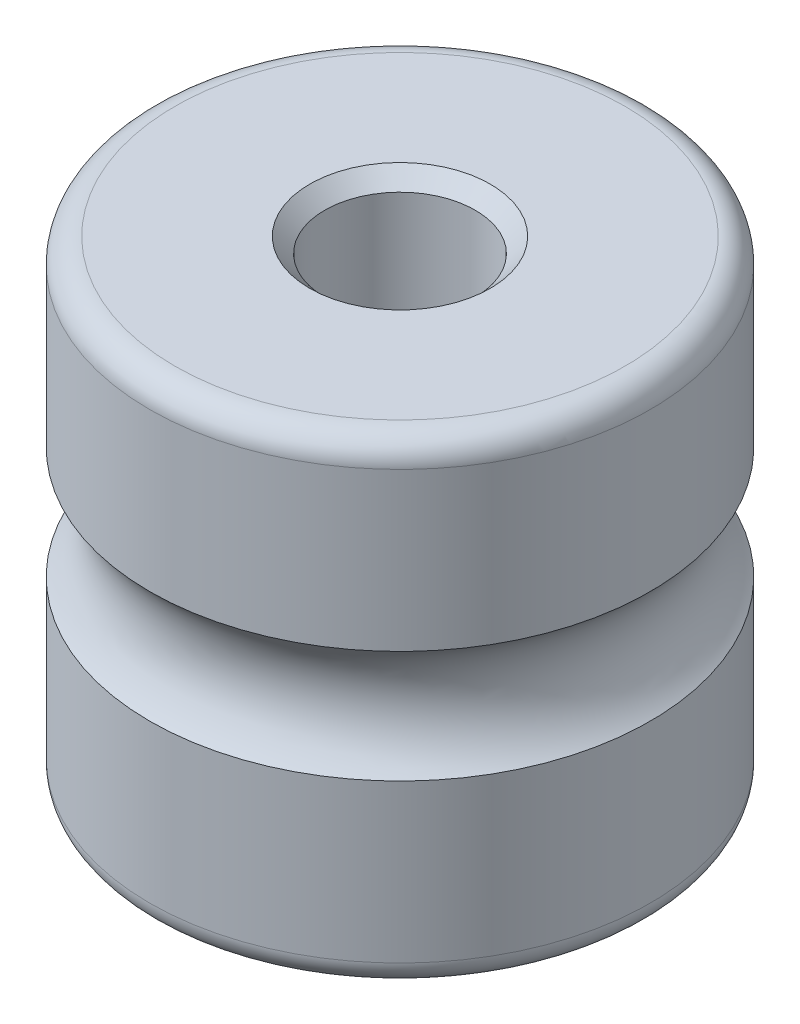
ISO-10303-21;
HEADER;
FILE_DESCRIPTION(('STEP AP214'),'2;1');
FILE_NAME('part.step','',(''),(''),'','','');
FILE_SCHEMA(('AUTOMOTIVE_DESIGN { 1 0 10303 214 1 1 1 1 }'));
ENDSEC;
DATA;
#1=APPLICATION_CONTEXT('core data for automotive mechanical design processes');
#2=APPLICATION_PROTOCOL_DEFINITION('international standard','automotive_design',2000,#1);
#3=PRODUCT_CONTEXT('',#1,'mechanical');
#4=PRODUCT('Part','Part','',(#3));
#5=PRODUCT_RELATED_PRODUCT_CATEGORY('part','',(#4));
#6=PRODUCT_DEFINITION_FORMATION('','',#4);
#7=PRODUCT_DEFINITION_CONTEXT('part definition',#1,'design');
#8=PRODUCT_DEFINITION('design','',#6,#7);
#9=PRODUCT_DEFINITION_SHAPE('','',#8);
#10=(LENGTH_UNIT() NAMED_UNIT(*) SI_UNIT(.MILLI.,.METRE.));
#11=(NAMED_UNIT(*) PLANE_ANGLE_UNIT() SI_UNIT($,.RADIAN.));
#12=(NAMED_UNIT(*) SI_UNIT($,.STERADIAN.) SOLID_ANGLE_UNIT());
#13=UNCERTAINTY_MEASURE_WITH_UNIT(LENGTH_MEASURE(1.E-05),#10,'distance_accuracy_value','');
#14=(GEOMETRIC_REPRESENTATION_CONTEXT(3) GLOBAL_UNCERTAINTY_ASSIGNED_CONTEXT((#13)) GLOBAL_UNIT_ASSIGNED_CONTEXT((#10,
#11,#12)) REPRESENTATION_CONTEXT('',''));
#15=CARTESIAN_POINT('',(0.,0.,0.));
#16=DIRECTION('',(0.,0.,1.));
#17=DIRECTION('',(1.,0.,0.));
#18=AXIS2_PLACEMENT_3D('',#15,#16,#17);
#19=CARTESIAN_POINT('',(-989.291415846363,750.161234304223,-54.7299999999999));
#20=DIRECTION('',(0.,-1.,0.));
#21=DIRECTION('',(0.,0.,-1.));
#22=AXIS2_PLACEMENT_3D('',#19,#20,#21);
#23=CYLINDRICAL_SURFACE('',#22,49.8549999999999);
#24=CARTESIAN_POINT('',(-989.291415846363,604.150000000002,-54.7299999999999));
#25=DIRECTION('',(0.,1.,0.));
#26=DIRECTION('',(0.,0.,1.));
#27=AXIS2_PLACEMENT_3D('',#24,#25,#26);
#28=CIRCLE('',#27,49.8549999999999);
#29=CARTESIAN_POINT('',(-989.291415846363,604.150000000002,-104.585));
#30=VERTEX_POINT('',#29);
#31=EDGE_CURVE('E10',#30,#30,#28,.F.);
#32=CARTESIAN_POINT('',(-989.291415846363,572.740339887501,-54.7299999999999));
#33=DIRECTION('',(0.,-1.,0.));
#34=DIRECTION('',(0.,0.,-1.));
#35=AXIS2_PLACEMENT_3D('',#32,#33,#34);
#36=CIRCLE('',#35,49.8549999999999);
#37=CARTESIAN_POINT('',(-989.291415846363,572.740339887501,-104.585));
#38=VERTEX_POINT('',#37);
#39=EDGE_CURVE('E70',#38,#38,#36,.F.);
#40=CARTESIAN_POINT('',(-989.291415846363,604.150000000002,-104.585));
#41=CARTESIAN_POINT('',(-989.291415846363,603.822816040497,-104.585));
#42=CARTESIAN_POINT('',(-989.291415846363,603.495632080991,-104.585));
#43=CARTESIAN_POINT('',(-989.291415846363,602.841264161981,-104.585));
#44=CARTESIAN_POINT('',(-989.291415846363,602.514080202476,-104.585));
#45=CARTESIAN_POINT('',(-989.291415846363,601.859712283465,-104.585));
#46=CARTESIAN_POINT('',(-989.291415846363,601.53252832396,-104.585));
#47=CARTESIAN_POINT('',(-989.291415846363,600.87816040495,-104.585));
#48=CARTESIAN_POINT('',(-989.291415846363,600.550976445445,-104.585));
#49=CARTESIAN_POINT('',(-989.291415846363,599.896608526434,-104.585));
#50=CARTESIAN_POINT('',(-989.291415846363,599.569424566929,-104.585));
#51=CARTESIAN_POINT('',(-989.291415846363,598.915056647918,-104.585));
#52=CARTESIAN_POINT('',(-989.291415846363,598.587872688413,-104.585));
#53=CARTESIAN_POINT('',(-989.291415846363,597.933504769403,-104.585));
#54=CARTESIAN_POINT('',(-989.291415846363,597.606320809898,-104.585));
#55=CARTESIAN_POINT('',(-989.291415846363,596.951952890887,-104.585));
#56=CARTESIAN_POINT('',(-989.291415846363,596.624768931382,-104.585));
#57=CARTESIAN_POINT('',(-989.291415846363,595.970401012371,-104.585));
#58=CARTESIAN_POINT('',(-989.291415846363,595.643217052866,-104.585));
#59=CARTESIAN_POINT('',(-989.291415846363,594.988849133856,-104.585));
#60=CARTESIAN_POINT('',(-989.291415846363,594.661665174351,-104.585));
#61=CARTESIAN_POINT('',(-989.291415846363,594.00729725534,-104.585));
#62=CARTESIAN_POINT('',(-989.291415846363,593.680113295835,-104.585));
#63=CARTESIAN_POINT('',(-989.291415846363,593.025745376824,-104.585));
#64=CARTESIAN_POINT('',(-989.291415846363,592.698561417319,-104.585));
#65=CARTESIAN_POINT('',(-989.291415846363,592.044193498309,-104.585));
#66=CARTESIAN_POINT('',(-989.291415846363,591.717009538804,-104.585));
#67=CARTESIAN_POINT('',(-989.291415846363,591.062641619793,-104.585));
#68=CARTESIAN_POINT('',(-989.291415846363,590.735457660288,-104.585));
#69=CARTESIAN_POINT('',(-989.291415846363,590.081089741278,-104.585));
#70=CARTESIAN_POINT('',(-989.291415846363,589.753905781772,-104.585));
#71=CARTESIAN_POINT('',(-989.291415846363,589.099537862762,-104.585));
#72=CARTESIAN_POINT('',(-989.291415846363,588.772353903257,-104.585));
#73=CARTESIAN_POINT('',(-989.291415846363,588.117985984246,-104.585));
#74=CARTESIAN_POINT('',(-989.291415846363,587.790802024741,-104.585));
#75=CARTESIAN_POINT('',(-989.291415846363,587.13643410573,-104.585));
#76=CARTESIAN_POINT('',(-989.291415846363,586.809250146225,-104.585));
#77=CARTESIAN_POINT('',(-989.291415846363,586.154882227215,-104.585));
#78=CARTESIAN_POINT('',(-989.291415846363,585.82769826771,-104.585));
#79=CARTESIAN_POINT('',(-989.291415846363,585.173330348699,-104.585));
#80=CARTESIAN_POINT('',(-989.291415846363,584.846146389194,-104.585));
#81=CARTESIAN_POINT('',(-989.291415846363,584.191778470184,-104.585));
#82=CARTESIAN_POINT('',(-989.291415846363,583.864594510678,-104.585));
#83=CARTESIAN_POINT('',(-989.291415846363,583.210226591668,-104.585));
#84=CARTESIAN_POINT('',(-989.291415846363,582.883042632163,-104.585));
#85=CARTESIAN_POINT('',(-989.291415846363,582.228674713152,-104.585));
#86=CARTESIAN_POINT('',(-989.291415846363,581.901490753647,-104.585));
#87=CARTESIAN_POINT('',(-989.291415846363,581.247122834637,-104.585));
#88=CARTESIAN_POINT('',(-989.291415846363,580.919938875131,-104.585));
#89=CARTESIAN_POINT('',(-989.291415846363,580.265570956121,-104.585));
#90=CARTESIAN_POINT('',(-989.291415846363,579.938386996616,-104.585));
#91=CARTESIAN_POINT('',(-989.291415846363,579.284019077605,-104.585));
#92=CARTESIAN_POINT('',(-989.291415846363,578.9568351181,-104.585));
#93=CARTESIAN_POINT('',(-989.291415846363,578.30246719909,-104.585));
#94=CARTESIAN_POINT('',(-989.291415846363,577.975283239584,-104.585));
#95=CARTESIAN_POINT('',(-989.291415846363,577.320915320574,-104.585));
#96=CARTESIAN_POINT('',(-989.291415846363,576.993731361069,-104.585));
#97=CARTESIAN_POINT('',(-989.291415846363,576.339363442058,-104.585));
#98=CARTESIAN_POINT('',(-989.291415846363,576.012179482553,-104.585));
#99=CARTESIAN_POINT('',(-989.291415846363,575.357811563543,-104.585));
#100=CARTESIAN_POINT('',(-989.291415846363,575.030627604037,-104.585));
#101=CARTESIAN_POINT('',(-989.291415846363,574.376259685027,-104.585));
#102=CARTESIAN_POINT('',(-989.291415846363,574.049075725522,-104.585));
#103=CARTESIAN_POINT('',(-989.291415846363,573.394707806511,-104.585));
#104=CARTESIAN_POINT('',(-989.291415846363,573.067523847006,-104.585));
#105=CARTESIAN_POINT('',(-989.291415846363,572.740339887501,-104.585));
#106=B_SPLINE_CURVE_WITH_KNOTS('',3,(#40,#41,#42,#43,#44,#45,#46,#47,#48,#49,#50,#51,#52,#53,
#54,#55,#56,#57,#58,#59,#60,#61,#62,#63,#64,#65,#66,#67,#68,#69,#70,#71,#72,#73,#74,#75,#76,#77,
#78,#79,#80,#81,#82,#83,#84,#85,#86,#87,#88,#89,#90,#91,#92,#93,#94,#95,#96,#97,#98,#99,#100,
#101,#102,#103,#104,#105),.UNSPECIFIED.,.F.,.F.,(4,2,2,2,2,2,2,2,2,2,2,2,2,2,2,2,2,2,2,2,2,2,2,
2,2,2,2,2,2,2,2,2,4),(0.,0.981551878515563,1.96310375703124,2.94465563554691,3.92620751406259,
4.90775939257826,5.88931127109393,6.87086314960961,7.85241502812517,8.83396690664084,
9.81551878515652,10.7970706636722,11.7786225421879,12.7601744207034,13.7417262992191,
14.7232781777348,15.7048300562505,16.6863819347661,17.6679338132818,18.6494856917975,
19.631037570313,20.6125894488287,21.5941413273444,22.5756932058601,23.5572450843757,
24.5387969628913,25.520348841407,26.5019007199226,27.4834525984383,28.465004476954,
29.4465563554697,30.4281082339853,31.4096601125009),.UNSPECIFIED.);
#107=EDGE_CURVE('BSEAM38',#30,#38,#106,.T.);
#108=ORIENTED_EDGE('',*,*,#31,.T.);
#109=ORIENTED_EDGE('',*,*,#39,.T.);
#110=ORIENTED_EDGE('',*,*,#107,.T.);
#111=ORIENTED_EDGE('',*,*,#107,.F.);
#112=EDGE_LOOP('',(#108,#110,#109,#111));
#113=FACE_BOUND('',#112,.T.);
#114=ADVANCED_FACE('F38',(#113),#23,.T.);
#115=CARTESIAN_POINT('',(-1069.29141584636,609.150000000002,107.105));
#116=DIRECTION('',(0.,1.,0.));
#117=DIRECTION('',(0.,0.,1.));
#118=AXIS2_PLACEMENT_3D('',#115,#116,#117);
#119=PLANE('',#118);
#120=CARTESIAN_POINT('',(-989.291415846363,609.150000000002,-54.7299999999999));
#121=DIRECTION('',(0.,1.,0.));
#122=DIRECTION('',(0.,0.,1.));
#123=AXIS2_PLACEMENT_3D('',#120,#121,#122);
#124=CIRCLE('',#123,44.8549999999999);
#125=CARTESIAN_POINT('',(-989.291415846363,609.150000000002,-9.87500000000001));
#126=VERTEX_POINT('',#125);
#127=EDGE_CURVE('E45',#126,#126,#124,.T.);
#128=ORIENTED_EDGE('',*,*,#127,.T.);
#129=EDGE_LOOP('',(#128));
#130=FACE_BOUND('',#129,.T.);
#131=CARTESIAN_POINT('',(-989.291415846363,609.150000000002,-54.7299999999999));
#132=DIRECTION('',(0.,1.,0.));
#133=DIRECTION('',(0.,0.,1.));
#134=AXIS2_PLACEMENT_3D('',#131,#132,#133);
#135=CIRCLE('',#134,18.);
#136=CARTESIAN_POINT('',(-989.291415846363,609.150000000002,-36.7299999999999));
#137=VERTEX_POINT('',#136);
#138=EDGE_CURVE('E58',#137,#137,#135,.F.);
#139=ORIENTED_EDGE('',*,*,#138,.T.);
#140=EDGE_LOOP('',(#139));
#141=FACE_BOUND('',#140,.T.);
#142=ADVANCED_FACE('F83',(#130,#141),#119,.T.);
#143=CARTESIAN_POINT('',(-989.291415846363,561.560000000002,-54.7299999999999));
#144=DIRECTION('',(0.,1.,0.));
#145=DIRECTION('',(0.,0.,1.));
#146=AXIS2_PLACEMENT_3D('',#143,#144,#145);
#147=TOROIDAL_SURFACE('',#146,59.855,14.9999999999999);
#148=CARTESIAN_POINT('',(-989.291415846363,550.379660112503,-54.7299999999999));
#149=DIRECTION('',(0.,1.,0.));
#150=DIRECTION('',(0.,0.,1.));
#151=AXIS2_PLACEMENT_3D('',#148,#149,#150);
#152=CIRCLE('',#151,49.8549999999999);
#153=CARTESIAN_POINT('',(-989.291415846363,550.379660112503,-104.585));
#154=VERTEX_POINT('',#153);
#155=EDGE_CURVE('E73',#154,#154,#152,.F.);
#156=ORIENTED_EDGE('',*,*,#155,.F.);
#157=EDGE_LOOP('',(#156));
#158=FACE_BOUND('',#157,.T.);
#159=ORIENTED_EDGE('',*,*,#39,.F.);
#160=EDGE_LOOP('',(#159));
#161=FACE_BOUND('',#160,.T.);
#162=ADVANCED_FACE('F79',(#158,#161),#147,.F.);
#163=CARTESIAN_POINT('',(-989.291415846363,513.970000000002,-54.7299999999999));
#164=DIRECTION('',(0.,1.,0.));
#165=DIRECTION('',(0.,0.,1.));
#166=AXIS2_PLACEMENT_3D('',#163,#164,#165);
#167=PLANE('',#166);
#168=CARTESIAN_POINT('',(-989.291415846363,513.970000000002,-54.7299999999999));
#169=DIRECTION('',(0.,1.,0.));
#170=DIRECTION('',(0.,0.,1.));
#171=AXIS2_PLACEMENT_3D('',#168,#169,#170);
#172=CIRCLE('',#171,44.8549999999999);
#173=CARTESIAN_POINT('',(-989.291415846363,513.970000000002,-9.87500000000001));
#174=VERTEX_POINT('',#173);
#175=EDGE_CURVE('E49',#174,#174,#172,.F.);
#176=ORIENTED_EDGE('',*,*,#175,.T.);
#177=EDGE_LOOP('',(#176));
#178=FACE_BOUND('',#177,.T.);
#179=CARTESIAN_POINT('',(-989.291415846363,513.970000000002,-54.7299999999999));
#180=DIRECTION('',(0.,1.,0.));
#181=DIRECTION('',(0.,0.,1.));
#182=AXIS2_PLACEMENT_3D('',#179,#180,#181);
#183=CIRCLE('',#182,18.);
#184=CARTESIAN_POINT('',(-989.291415846363,513.970000000002,-36.7299999999999));
#185=VERTEX_POINT('',#184);
#186=EDGE_CURVE('E67',#185,#185,#183,.T.);
#187=ORIENTED_EDGE('',*,*,#186,.T.);
#188=EDGE_LOOP('',(#187));
#189=FACE_BOUND('',#188,.T.);
#190=ADVANCED_FACE('F82',(#178,#189),#167,.F.);
#191=CARTESIAN_POINT('',(-989.291415846363,518.970000000002,-54.7299999999999));
#192=DIRECTION('',(0.,1.,0.));
#193=DIRECTION('',(0.,0.,1.));
#194=AXIS2_PLACEMENT_3D('',#191,#192,#193);
#195=CIRCLE('',#194,49.8549999999999);
#196=CARTESIAN_POINT('',(-989.291415846363,518.970000000002,-104.585));
#197=VERTEX_POINT('',#196);
#198=EDGE_CURVE('E53',#197,#197,#195,.T.);
#199=CARTESIAN_POINT('',(-989.291415846363,518.970000000002,-104.585));
#200=CARTESIAN_POINT('',(-989.291415846363,519.297183959507,-104.585));
#201=CARTESIAN_POINT('',(-989.291415846363,519.624367919012,-104.585));
#202=CARTESIAN_POINT('',(-989.291415846363,520.278735838023,-104.585));
#203=CARTESIAN_POINT('',(-989.291415846363,520.605919797528,-104.585));
#204=CARTESIAN_POINT('',(-989.291415846363,521.260287716538,-104.585));
#205=CARTESIAN_POINT('',(-989.291415846363,521.587471676044,-104.585));
#206=CARTESIAN_POINT('',(-989.291415846363,522.241839595054,-104.585));
#207=CARTESIAN_POINT('',(-989.291415846363,522.569023554559,-104.585));
#208=CARTESIAN_POINT('',(-989.291415846363,523.22339147357,-104.585));
#209=CARTESIAN_POINT('',(-989.291415846363,523.550575433075,-104.585));
#210=CARTESIAN_POINT('',(-989.291415846363,524.204943352085,-104.585));
#211=CARTESIAN_POINT('',(-989.291415846363,524.532127311591,-104.585));
#212=CARTESIAN_POINT('',(-989.291415846363,525.186495230601,-104.585));
#213=CARTESIAN_POINT('',(-989.291415846363,525.513679190106,-104.585));
#214=CARTESIAN_POINT('',(-989.291415846363,526.168047109117,-104.585));
#215=CARTESIAN_POINT('',(-989.291415846363,526.495231068622,-104.585));
#216=CARTESIAN_POINT('',(-989.291415846363,527.149598987632,-104.585));
#217=CARTESIAN_POINT('',(-989.291415846363,527.476782947138,-104.585));
#218=CARTESIAN_POINT('',(-989.291415846363,528.131150866148,-104.585));
#219=CARTESIAN_POINT('',(-989.291415846363,528.458334825653,-104.585));
#220=CARTESIAN_POINT('',(-989.291415846363,529.112702744664,-104.585));
#221=CARTESIAN_POINT('',(-989.291415846363,529.439886704169,-104.585));
#222=CARTESIAN_POINT('',(-989.291415846363,530.094254623179,-104.585));
#223=CARTESIAN_POINT('',(-989.291415846363,530.421438582685,-104.585));
#224=CARTESIAN_POINT('',(-989.291415846363,531.075806501695,-104.585));
#225=CARTESIAN_POINT('',(-989.291415846363,531.4029904612,-104.585));
#226=CARTESIAN_POINT('',(-989.291415846363,532.057358380211,-104.585));
#227=CARTESIAN_POINT('',(-989.291415846363,532.384542339716,-104.585));
#228=CARTESIAN_POINT('',(-989.291415846363,533.038910258726,-104.585));
#229=CARTESIAN_POINT('',(-989.291415846363,533.366094218232,-104.585));
#230=CARTESIAN_POINT('',(-989.291415846363,534.020462137242,-104.585));
#231=CARTESIAN_POINT('',(-989.291415846363,534.347646096747,-104.585));
#232=CARTESIAN_POINT('',(-989.291415846363,535.002014015758,-104.585));
#233=CARTESIAN_POINT('',(-989.291415846363,535.329197975263,-104.585));
#234=CARTESIAN_POINT('',(-989.291415846363,535.983565894273,-104.585));
#235=CARTESIAN_POINT('',(-989.291415846363,536.310749853779,-104.585));
#236=CARTESIAN_POINT('',(-989.291415846363,536.965117772789,-104.585));
#237=CARTESIAN_POINT('',(-989.291415846363,537.292301732294,-104.585));
#238=CARTESIAN_POINT('',(-989.291415846363,537.946669651305,-104.585));
#239=CARTESIAN_POINT('',(-989.291415846363,538.27385361081,-104.585));
#240=CARTESIAN_POINT('',(-989.291415846363,538.92822152982,-104.585));
#241=CARTESIAN_POINT('',(-989.291415846363,539.255405489326,-104.585));
#242=CARTESIAN_POINT('',(-989.291415846363,539.909773408336,-104.585));
#243=CARTESIAN_POINT('',(-989.291415846363,540.236957367841,-104.585));
#244=CARTESIAN_POINT('',(-989.291415846363,540.891325286852,-104.585));
#245=CARTESIAN_POINT('',(-989.291415846363,541.218509246357,-104.585));
#246=CARTESIAN_POINT('',(-989.291415846363,541.872877165368,-104.585));
#247=CARTESIAN_POINT('',(-989.291415846363,542.200061124873,-104.585));
#248=CARTESIAN_POINT('',(-989.291415846363,542.854429043883,-104.585));
#249=CARTESIAN_POINT('',(-989.291415846363,543.181613003388,-104.585));
#250=CARTESIAN_POINT('',(-989.291415846363,543.835980922399,-104.585));
#251=CARTESIAN_POINT('',(-989.291415846363,544.163164881904,-104.585));
#252=CARTESIAN_POINT('',(-989.291415846363,544.817532800914,-104.585));
#253=CARTESIAN_POINT('',(-989.291415846363,545.14471676042,-104.585));
#254=CARTESIAN_POINT('',(-989.291415846363,545.79908467943,-104.585));
#255=CARTESIAN_POINT('',(-989.291415846363,546.126268638935,-104.585));
#256=CARTESIAN_POINT('',(-989.291415846363,546.780636557946,-104.585));
#257=CARTESIAN_POINT('',(-989.291415846363,547.107820517451,-104.585));
#258=CARTESIAN_POINT('',(-989.291415846363,547.762188436461,-104.585));
#259=CARTESIAN_POINT('',(-989.291415846363,548.089372395967,-104.585));
#260=CARTESIAN_POINT('',(-989.291415846363,548.743740314977,-104.585));
#261=CARTESIAN_POINT('',(-989.291415846363,549.070924274482,-104.585));
#262=CARTESIAN_POINT('',(-989.291415846363,549.725292193493,-104.585));
#263=CARTESIAN_POINT('',(-989.291415846363,550.052476152998,-104.585));
#264=CARTESIAN_POINT('',(-989.291415846363,550.379660112503,-104.585));
#265=B_SPLINE_CURVE_WITH_KNOTS('',3,(#199,#200,#201,#202,#203,#204,#205,#206,#207,#208,#209,
#210,#211,#212,#213,#214,#215,#216,#217,#218,#219,#220,#221,#222,#223,#224,#225,#226,#227,#228,
#229,#230,#231,#232,#233,#234,#235,#236,#237,#238,#239,#240,#241,#242,#243,#244,#245,#246,#247,
#248,#249,#250,#251,#252,#253,#254,#255,#256,#257,#258,#259,#260,#261,#262,#263,#264),
.UNSPECIFIED.,.F.,.F.,(4,2,2,2,2,2,2,2,2,2,2,2,2,2,2,2,2,2,2,2,2,2,2,2,2,2,2,2,2,2,2,2,4),(0.,
0.981551878515674,1.96310375703135,2.94465563554702,3.9262075140627,4.90775939257837,
5.88931127109404,6.87086314960972,7.85241502812539,8.83396690664107,9.81551878515674,
10.7970706636723,11.778622542188,12.7601744207037,13.7417262992193,14.723278177735,
15.7048300562507,16.6863819347663,17.667933813282,18.6494856917977,19.6310375703134,
20.612589448829,21.5941413273447,22.5756932058604,23.5572450843761,24.5387969628917,
25.5203488414074,26.5019007199231,27.4834525984388,28.4650044769544,29.44655635547,
30.4281082339857,31.4096601125013),.UNSPECIFIED.);
#266=EDGE_CURVE('BSEAM77',#197,#154,#265,.T.);
#267=ORIENTED_EDGE('',*,*,#198,.T.);
#268=ORIENTED_EDGE('',*,*,#155,.T.);
#269=ORIENTED_EDGE('',*,*,#266,.T.);
#270=ORIENTED_EDGE('',*,*,#266,.F.);
#271=EDGE_LOOP('',(#267,#269,#268,#270));
#272=FACE_BOUND('',#271,.T.);
#273=ADVANCED_FACE('F77',(#272),#23,.T.);
#274=CARTESIAN_POINT('',(-989.291415846363,359.150000000002,-54.7299999999999));
#275=DIRECTION('',(0.,1.,0.));
#276=DIRECTION('',(0.,0.,1.));
#277=AXIS2_PLACEMENT_3D('',#274,#275,#276);
#278=CYLINDRICAL_SURFACE('',#277,15.);
#279=CARTESIAN_POINT('',(-989.291415846363,516.970000000002,-54.7299999999999));
#280=DIRECTION('',(0.,1.,0.));
#281=DIRECTION('',(0.,0.,1.));
#282=AXIS2_PLACEMENT_3D('',#279,#280,#281);
#283=CIRCLE('',#282,15.);
#284=CARTESIAN_POINT('',(-989.291415846363,516.970000000002,-39.7299999999999));
#285=VERTEX_POINT('',#284);
#286=EDGE_CURVE('E61',#285,#285,#283,.F.);
#287=ORIENTED_EDGE('',*,*,#286,.T.);
#288=EDGE_LOOP('',(#287));
#289=FACE_BOUND('',#288,.T.);
#290=CARTESIAN_POINT('',(-989.291415846363,606.150000000002,-54.7299999999999));
#291=DIRECTION('',(0.,1.,0.));
#292=DIRECTION('',(0.,0.,1.));
#293=AXIS2_PLACEMENT_3D('',#290,#291,#292);
#294=CIRCLE('',#293,15.);
#295=CARTESIAN_POINT('',(-989.291415846363,606.150000000002,-39.7299999999999));
#296=VERTEX_POINT('',#295);
#297=EDGE_CURVE('E64',#296,#296,#294,.T.);
#298=ORIENTED_EDGE('',*,*,#297,.T.);
#299=EDGE_LOOP('',(#298));
#300=FACE_BOUND('',#299,.T.);
#301=ADVANCED_FACE('F95',(#289,#300),#278,.F.);
#302=CARTESIAN_POINT('',(-989.291415846363,513.970000000002,-54.7299999999999));
#303=DIRECTION('',(0.,-1.,0.));
#304=DIRECTION('',(0.,0.,-1.));
#305=AXIS2_PLACEMENT_3D('',#302,#303,#304);
#306=CONICAL_SURFACE('',#305,18.,0.785398163397451);
#307=ORIENTED_EDGE('',*,*,#286,.F.);
#308=EDGE_LOOP('',(#307));
#309=FACE_BOUND('',#308,.T.);
#310=ORIENTED_EDGE('',*,*,#186,.F.);
#311=EDGE_LOOP('',(#310));
#312=FACE_BOUND('',#311,.T.);
#313=ADVANCED_FACE('F101',(#309,#312),#306,.F.);
#314=CARTESIAN_POINT('',(-989.291415846363,606.150000000002,-54.7299999999999));
#315=DIRECTION('',(0.,1.,0.));
#316=DIRECTION('',(0.,0.,1.));
#317=AXIS2_PLACEMENT_3D('',#314,#315,#316);
#318=CONICAL_SURFACE('',#317,15.,0.78539816339746);
#319=ORIENTED_EDGE('',*,*,#138,.F.);
#320=EDGE_LOOP('',(#319));
#321=FACE_BOUND('',#320,.T.);
#322=ORIENTED_EDGE('',*,*,#297,.F.);
#323=EDGE_LOOP('',(#322));
#324=FACE_BOUND('',#323,.T.);
#325=ADVANCED_FACE('F109',(#321,#324),#318,.F.);
#326=CARTESIAN_POINT('',(-989.291415846363,518.970000000002,-54.7299999999999));
#327=DIRECTION('',(0.,1.,0.));
#328=DIRECTION('',(0.,0.,1.));
#329=AXIS2_PLACEMENT_3D('',#326,#327,#328);
#330=TOROIDAL_SURFACE('',#329,44.8549999999999,5.);
#331=ORIENTED_EDGE('',*,*,#175,.F.);
#332=EDGE_LOOP('',(#331));
#333=FACE_BOUND('',#332,.T.);
#334=ORIENTED_EDGE('',*,*,#198,.F.);
#335=EDGE_LOOP('',(#334));
#336=FACE_BOUND('',#335,.T.);
#337=ADVANCED_FACE('F107',(#333,#336),#330,.T.);
#338=CARTESIAN_POINT('',(-989.291415846363,604.150000000002,-54.7299999999999));
#339=DIRECTION('',(0.,1.,0.));
#340=DIRECTION('',(0.,0.,1.));
#341=AXIS2_PLACEMENT_3D('',#338,#339,#340);
#342=TOROIDAL_SURFACE('',#341,44.8549999999999,5.);
#343=ORIENTED_EDGE('',*,*,#31,.F.);
#344=EDGE_LOOP('',(#343));
#345=FACE_BOUND('',#344,.T.);
#346=ORIENTED_EDGE('',*,*,#127,.F.);
#347=EDGE_LOOP('',(#346));
#348=FACE_BOUND('',#347,.T.);
#349=ADVANCED_FACE('F40',(#345,#348),#342,.T.);
#350=CLOSED_SHELL('',(#114,#142,#162,#190,#273,#301,#313,#325,#337,#349));
#351=MANIFOLD_SOLID_BREP('B2',#350);
#352=ADVANCED_BREP_SHAPE_REPRESENTATION('',(#18,#351),#14);
#353=SHAPE_DEFINITION_REPRESENTATION(#9,#352);
ENDSEC;
END-ISO-10303-21;
